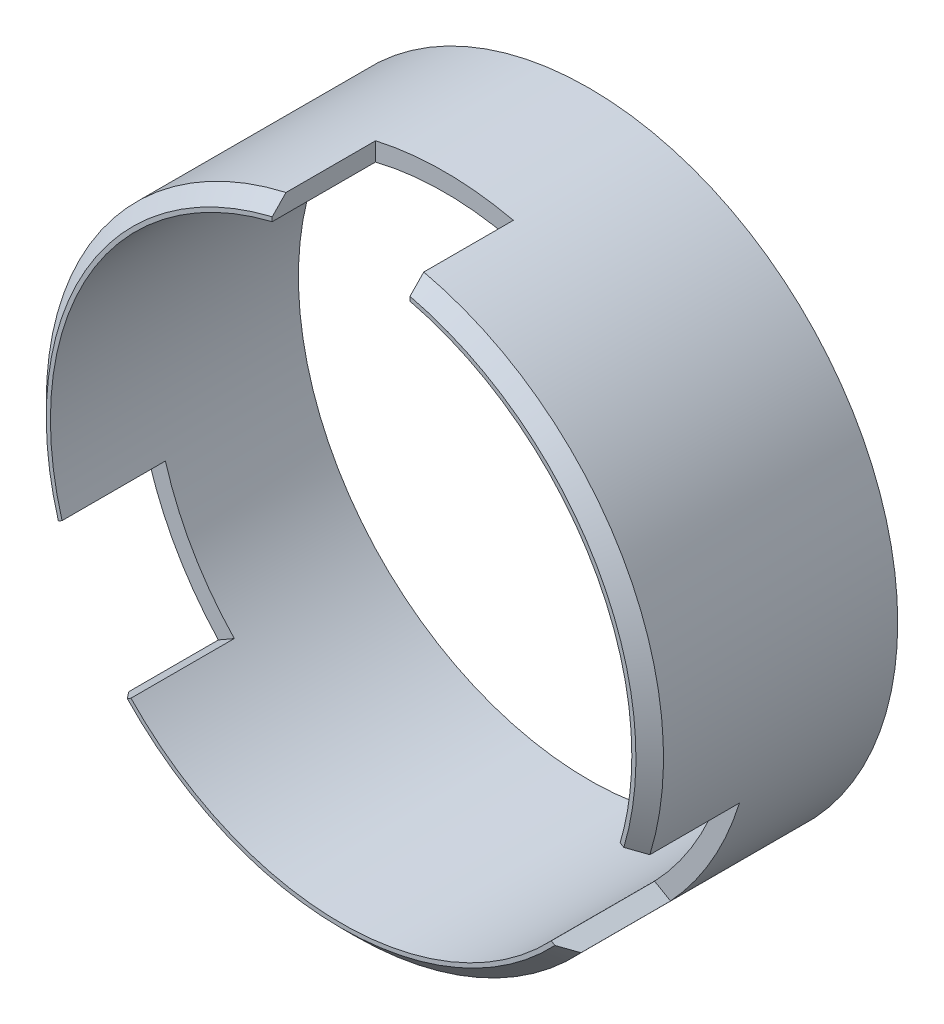
ISO-10303-21;
HEADER;
FILE_DESCRIPTION(('STEP AP214'),'2;1');
FILE_NAME('part.step','',(''),(''),'','','');
FILE_SCHEMA(('AUTOMOTIVE_DESIGN { 1 0 10303 214 1 1 1 1 }'));
ENDSEC;
DATA;
#1=APPLICATION_CONTEXT('core data for automotive mechanical design processes');
#2=APPLICATION_PROTOCOL_DEFINITION('international standard','automotive_design',2000,#1);
#3=PRODUCT_CONTEXT('',#1,'mechanical');
#4=PRODUCT('Part','Part','',(#3));
#5=PRODUCT_RELATED_PRODUCT_CATEGORY('part','',(#4));
#6=PRODUCT_DEFINITION_FORMATION('','',#4);
#7=PRODUCT_DEFINITION_CONTEXT('part definition',#1,'design');
#8=PRODUCT_DEFINITION('design','',#6,#7);
#9=PRODUCT_DEFINITION_SHAPE('','',#8);
#10=(LENGTH_UNIT() NAMED_UNIT(*) SI_UNIT(.MILLI.,.METRE.));
#11=(NAMED_UNIT(*) PLANE_ANGLE_UNIT() SI_UNIT($,.RADIAN.));
#12=(NAMED_UNIT(*) SI_UNIT($,.STERADIAN.) SOLID_ANGLE_UNIT());
#13=UNCERTAINTY_MEASURE_WITH_UNIT(LENGTH_MEASURE(1.E-05),#10,'distance_accuracy_value','');
#14=(GEOMETRIC_REPRESENTATION_CONTEXT(3) GLOBAL_UNCERTAINTY_ASSIGNED_CONTEXT((#13)) GLOBAL_UNIT_ASSIGNED_CONTEXT((#10,
#11,#12)) REPRESENTATION_CONTEXT('',''));
#15=CARTESIAN_POINT('',(0.,0.,0.));
#16=DIRECTION('',(0.,0.,1.));
#17=DIRECTION('',(1.,0.,0.));
#18=AXIS2_PLACEMENT_3D('',#15,#16,#17);
#19=CARTESIAN_POINT('',(0.,0.,18.));
#20=DIRECTION('',(0.,0.,1.));
#21=DIRECTION('',(1.,0.,0.));
#22=AXIS2_PLACEMENT_3D('',#19,#20,#21);
#23=PLANE('',#22);
#24=CARTESIAN_POINT('',(0.,0.,18.));
#25=DIRECTION('',(0.,0.,1.));
#26=DIRECTION('',(1.,0.,0.));
#27=AXIS2_PLACEMENT_3D('',#24,#25,#26);
#28=CIRCLE('',#27,21.1);
#29=CARTESIAN_POINT('',(20.2526758547838,-5.91938516490317,18.));
#30=VERTEX_POINT('',#29);
#31=CARTESIAN_POINT('',(5.0000000000032,20.499024367027,18.));
#32=VERTEX_POINT('',#31);
#33=EDGE_CURVE('E124',#30,#32,#28,.T.);
#34=ORIENTED_EDGE('',*,*,#33,.F.);
#35=DIRECTION('',(0.866025403877032,-0.499999999839625,0.));
#36=VECTOR('',#35,1.);
#37=CARTESIAN_POINT('',(20.252675855,-5.919385165,18.));
#38=LINE('',#37,#36);
#39=CARTESIAN_POINT('',(20.5199889011268,-6.07371842411497,18.0000000000514));
#40=VERTEX_POINT('',#39);
#41=EDGE_CURVE('E115',#30,#40,#38,.T.);
#42=ORIENTED_EDGE('',*,*,#41,.T.);
#43=CARTESIAN_POINT('',(0.,0.,18.0000000001028));
#44=DIRECTION('',(0.,0.,-1.));
#45=DIRECTION('',(-1.,0.,0.));
#46=AXIS2_PLACEMENT_3D('',#43,#44,#45);
#47=CIRCLE('',#46,21.3999999998972);
#48=CARTESIAN_POINT('',(5.,20.8076908857711,18.0000000000514));
#49=VERTEX_POINT('',#48);
#50=EDGE_CURVE('E250',#49,#40,#47,.T.);
#51=ORIENTED_EDGE('',*,*,#50,.F.);
#52=DIRECTION('',(0.,1.,0.));
#53=VECTOR('',#52,1.);
#54=CARTESIAN_POINT('',(5.,19.,18.));
#55=LINE('',#54,#53);
#56=EDGE_CURVE('E149',#32,#49,#55,.T.);
#57=ORIENTED_EDGE('',*,*,#56,.F.);
#58=EDGE_LOOP('',(#34,#42,#51,#57));
#59=FACE_BOUND('',#58,.T.);
#60=ADVANCED_FACE('F16',(#59),#23,.T.);
#61=CARTESIAN_POINT('',(0.,0.,18.));
#62=DIRECTION('',(0.,0.,1.));
#63=DIRECTION('',(1.,0.,0.));
#64=AXIS2_PLACEMENT_3D('',#61,#62,#63);
#65=PLANE('',#64);
#66=DIRECTION('',(-0.866025402474184,-0.500000002269428,0.));
#67=VECTOR('',#66,1.);
#68=CARTESIAN_POINT('',(-15.252675855,-14.579639202,18.));
#69=LINE('',#68,#67);
#70=CARTESIAN_POINT('',(-15.2526758547904,-14.579639202407,18.));
#71=VERTEX_POINT('',#70);
#72=CARTESIAN_POINT('',(-15.5199889010034,-14.7339724620438,18.0000000000109));
#73=VERTEX_POINT('',#72);
#74=EDGE_CURVE('E102',#71,#73,#69,.T.);
#75=ORIENTED_EDGE('',*,*,#74,.T.);
#76=CARTESIAN_POINT('',(0.,0.,18.0000000000218));
#77=DIRECTION('',(0.,0.,-1.));
#78=DIRECTION('',(-1.,0.,0.));
#79=AXIS2_PLACEMENT_3D('',#76,#77,#78);
#80=CIRCLE('',#79,21.3999999999782);
#81=CARTESIAN_POINT('',(15.5199889013319,-14.7339724616978,18.0000000000109));
#82=VERTEX_POINT('',#81);
#83=EDGE_CURVE('E134',#82,#73,#80,.T.);
#84=ORIENTED_EDGE('',*,*,#83,.F.);
#85=DIRECTION('',(0.866025403838329,-0.499999999906659,0.));
#86=VECTOR('',#85,1.);
#87=CARTESIAN_POINT('',(13.954482672,-13.830127019,18.));
#88=LINE('',#87,#86);
#89=CARTESIAN_POINT('',(15.252675854768,-14.5796392023447,18.));
#90=VERTEX_POINT('',#89);
#91=EDGE_CURVE('E120',#90,#82,#88,.T.);
#92=ORIENTED_EDGE('',*,*,#91,.F.);
#93=CARTESIAN_POINT('',(0.,0.,18.));
#94=DIRECTION('',(0.,0.,1.));
#95=DIRECTION('',(1.,0.,0.));
#96=AXIS2_PLACEMENT_3D('',#93,#94,#95);
#97=CIRCLE('',#96,21.1);
#98=EDGE_CURVE('E19',#71,#90,#97,.T.);
#99=ORIENTED_EDGE('',*,*,#98,.F.);
#100=EDGE_LOOP('',(#75,#84,#92,#99));
#101=FACE_BOUND('',#100,.T.);
#102=ADVANCED_FACE('F119',(#101),#65,.T.);
#103=CARTESIAN_POINT('',(-5.,24.,10.5));
#104=DIRECTION('',(-1.,0.,0.));
#105=DIRECTION('',(0.,0.,1.));
#106=AXIS2_PLACEMENT_3D('',#103,#104,#105);
#107=PLANE('',#106);
#108=DIRECTION('',(0.,1.,0.));
#109=VECTOR('',#108,1.);
#110=CARTESIAN_POINT('',(-5.,24.,18.));
#111=LINE('',#110,#109);
#112=CARTESIAN_POINT('',(-5.,20.8076908858692,17.999999999956));
#113=VERTEX_POINT('',#112);
#114=CARTESIAN_POINT('',(-5.0000000000032,20.499024367027,18.));
#115=VERTEX_POINT('',#114);
#116=EDGE_CURVE('E114',#113,#115,#111,.F.);
#117=ORIENTED_EDGE('',*,*,#116,.T.);
#118=DIRECTION('',(0.,0.,1.));
#119=VECTOR('',#118,1.);
#120=CARTESIAN_POINT('',(-5.0000000000064,20.4990243670263,9.));
#121=LINE('',#120,#119);
#122=CARTESIAN_POINT('',(-5.0000000000032,20.499024367027,10.5));
#123=VERTEX_POINT('',#122);
#124=EDGE_CURVE('E323',#123,#115,#121,.T.);
#125=ORIENTED_EDGE('',*,*,#124,.F.);
#126=DIRECTION('',(0.,1.,0.));
#127=VECTOR('',#126,1.);
#128=CARTESIAN_POINT('',(-5.,19.,10.5));
#129=LINE('',#128,#127);
#130=CARTESIAN_POINT('',(-4.99999999999862,21.8348345539877,10.4999999999999));
#131=VERTEX_POINT('',#130);
#132=EDGE_CURVE('E151',#131,#123,#129,.F.);
#133=ORIENTED_EDGE('',*,*,#132,.F.);
#134=DIRECTION('',(0.,0.,-1.));
#135=VECTOR('',#134,1.);
#136=CARTESIAN_POINT('',(-4.99999999999725,21.834834553988,8.5));
#137=LINE('',#136,#135);
#138=CARTESIAN_POINT('',(-4.99999999999862,21.8348345539878,16.9999999999998));
#139=VERTEX_POINT('',#138);
#140=EDGE_CURVE('E184',#139,#131,#137,.T.);
#141=ORIENTED_EDGE('',*,*,#140,.F.);
#142=CARTESIAN_POINT('',(-5.00000000002054,20.8076908859266,17.9999999999244));
#143=CARTESIAN_POINT('',(-5.00000000001027,20.9789861483327,17.8334408241759));
#144=CARTESIAN_POINT('',(-5.00000000000342,21.1502290854001,17.6668279027869));
#145=CARTESIAN_POINT('',(-4.99999999999658,21.4926103080866,17.3334945694782));
#146=CARTESIAN_POINT('',(-4.99999999999658,21.6637485937063,17.1667741575589));
#147=CARTESIAN_POINT('',(-5.,21.8348345539877,16.9999999999997));
#148=B_SPLINE_CURVE_WITH_KNOTS('',3,(#142,#143,#144,#145,#146,#147),.UNSPECIFIED.,.F.,.F.,(4,2,
4),(0.,0.716767801748237,1.43353560027046),.UNSPECIFIED.);
#149=EDGE_CURVE('E261',#113,#139,#148,.T.);
#150=ORIENTED_EDGE('',*,*,#149,.F.);
#151=EDGE_LOOP('',(#117,#125,#133,#141,#150));
#152=FACE_BOUND('',#151,.T.);
#153=ADVANCED_FACE('F275',(#152),#107,.F.);
#154=CARTESIAN_POINT('',(-5.,19.,10.5));
#155=DIRECTION('',(0.,0.,-1.));
#156=DIRECTION('',(-1.,0.,0.));
#157=AXIS2_PLACEMENT_3D('',#154,#155,#156);
#158=PLANE('',#157);
#159=DIRECTION('',(0.,1.,0.));
#160=VECTOR('',#159,1.);
#161=CARTESIAN_POINT('',(5.,19.,10.5));
#162=LINE('',#161,#160);
#163=CARTESIAN_POINT('',(4.99999999999862,21.8348345539877,10.4999999999999));
#164=VERTEX_POINT('',#163);
#165=CARTESIAN_POINT('',(5.0000000000032,20.499024367027,10.5));
#166=VERTEX_POINT('',#165);
#167=EDGE_CURVE('E125',#164,#166,#162,.F.);
#168=ORIENTED_EDGE('',*,*,#167,.F.);
#169=CARTESIAN_POINT('',(0.,0.,10.4999999999999));
#170=DIRECTION('',(0.,0.,-1.));
#171=DIRECTION('',(-1.,0.,0.));
#172=AXIS2_PLACEMENT_3D('',#169,#170,#171);
#173=CIRCLE('',#172,22.4);
#174=EDGE_CURVE('E181',#131,#164,#173,.T.);
#175=ORIENTED_EDGE('',*,*,#174,.F.);
#176=ORIENTED_EDGE('',*,*,#132,.T.);
#177=CARTESIAN_POINT('',(0.,0.,10.5));
#178=DIRECTION('',(0.,0.,1.));
#179=DIRECTION('',(1.,0.,0.));
#180=AXIS2_PLACEMENT_3D('',#177,#178,#179);
#181=CIRCLE('',#180,21.1);
#182=EDGE_CURVE('E157',#166,#123,#181,.T.);
#183=ORIENTED_EDGE('',*,*,#182,.F.);
#184=EDGE_LOOP('',(#168,#175,#176,#183));
#185=FACE_BOUND('',#184,.T.);
#186=ADVANCED_FACE('F272',(#185),#158,.F.);
#187=CARTESIAN_POINT('',(5.,19.,10.5));
#188=DIRECTION('',(1.,0.,0.));
#189=DIRECTION('',(0.,0.,-1.));
#190=AXIS2_PLACEMENT_3D('',#187,#188,#189);
#191=PLANE('',#190);
#192=ORIENTED_EDGE('',*,*,#167,.T.);
#193=DIRECTION('',(0.,0.,-1.));
#194=VECTOR('',#193,1.);
#195=CARTESIAN_POINT('',(5.0000000000064,20.4990243670263,9.));
#196=LINE('',#195,#194);
#197=EDGE_CURVE('E154',#32,#166,#196,.T.);
#198=ORIENTED_EDGE('',*,*,#197,.F.);
#199=ORIENTED_EDGE('',*,*,#56,.T.);
#200=CARTESIAN_POINT('',(5.,21.8348345539877,16.9999999999997));
#201=CARTESIAN_POINT('',(5.,21.6637485936958,17.1667741575732));
#202=CARTESIAN_POINT('',(5.,21.4926103080636,17.3334945695047));
#203=CARTESIAN_POINT('',(5.,21.1502290853478,17.6668279028337));
#204=CARTESIAN_POINT('',(5.,20.9789861482639,17.8334408242307));
#205=CARTESIAN_POINT('',(5.,20.8076908858391,17.9999999999852));
#206=B_SPLINE_CURVE_WITH_KNOTS('',3,(#200,#201,#202,#203,#204,#205),.UNSPECIFIED.,.F.,.F.,(4,2,
4),(0.,0.716767798574769,1.43353560037556),.UNSPECIFIED.);
#207=CARTESIAN_POINT('',(4.99999999999862,21.8348345539878,16.9999999999998));
#208=VERTEX_POINT('',#207);
#209=EDGE_CURVE('E253',#208,#49,#206,.T.);
#210=ORIENTED_EDGE('',*,*,#209,.F.);
#211=DIRECTION('',(0.,0.,1.));
#212=VECTOR('',#211,1.);
#213=CARTESIAN_POINT('',(4.99999999999725,21.834834553988,8.5));
#214=LINE('',#213,#212);
#215=EDGE_CURVE('E180',#164,#208,#214,.T.);
#216=ORIENTED_EDGE('',*,*,#215,.F.);
#217=EDGE_LOOP('',(#192,#198,#199,#210,#216));
#218=FACE_BOUND('',#217,.T.);
#219=ADVANCED_FACE('F268',(#218),#191,.F.);
#220=CARTESIAN_POINT('',(0.,0.,0.));
#221=DIRECTION('',(0.,0.,1.));
#222=DIRECTION('',(1.,0.,0.));
#223=AXIS2_PLACEMENT_3D('',#220,#221,#222);
#224=CYLINDRICAL_SURFACE('',#223,21.1);
#225=CARTESIAN_POINT('',(0.,0.,0.));
#226=DIRECTION('',(0.,0.,1.));
#227=DIRECTION('',(1.,0.,0.));
#228=AXIS2_PLACEMENT_3D('',#225,#226,#227);
#229=CIRCLE('',#228,21.1);
#230=CARTESIAN_POINT('',(21.1,0.,0.));
#231=VERTEX_POINT('',#230);
#232=EDGE_CURVE('E177',#231,#231,#229,.T.);
#233=ORIENTED_EDGE('',*,*,#232,.F.);
#234=EDGE_LOOP('',(#233));
#235=FACE_BOUND('',#234,.T.);
#236=ORIENTED_EDGE('',*,*,#124,.T.);
#237=CARTESIAN_POINT('',(0.,0.,18.));
#238=DIRECTION('',(0.,0.,1.));
#239=DIRECTION('',(1.,0.,0.));
#240=AXIS2_PLACEMENT_3D('',#237,#238,#239);
#241=CIRCLE('',#240,21.1);
#242=CARTESIAN_POINT('',(-20.2526758549088,-5.91938516468666,18.));
#243=VERTEX_POINT('',#242);
#244=EDGE_CURVE('E172',#243,#115,#241,.F.);
#245=ORIENTED_EDGE('',*,*,#244,.F.);
#246=DIRECTION('',(0.,0.,1.));
#247=VECTOR('',#246,1.);
#248=CARTESIAN_POINT('',(-20.2526758552258,-5.91938516460897,10.5));
#249=LINE('',#248,#247);
#250=CARTESIAN_POINT('',(-20.252675854974,-5.91938516446362,10.5));
#251=VERTEX_POINT('',#250);
#252=EDGE_CURVE('E307',#251,#243,#249,.T.);
#253=ORIENTED_EDGE('',*,*,#252,.F.);
#254=CARTESIAN_POINT('',(0.,0.,10.5));
#255=DIRECTION('',(0.,0.,1.));
#256=DIRECTION('',(1.,0.,0.));
#257=AXIS2_PLACEMENT_3D('',#254,#255,#256);
#258=CIRCLE('',#257,21.1);
#259=CARTESIAN_POINT('',(-15.2526758547904,-14.579639202407,10.5));
#260=VERTEX_POINT('',#259);
#261=EDGE_CURVE('E129',#260,#251,#258,.F.);
#262=ORIENTED_EDGE('',*,*,#261,.F.);
#263=DIRECTION('',(0.,0.,1.));
#264=VECTOR('',#263,1.);
#265=CARTESIAN_POINT('',(-15.2526758545427,-14.579639202792,10.5));
#266=LINE('',#265,#264);
#267=EDGE_CURVE('E107',#71,#260,#266,.F.);
#268=ORIENTED_EDGE('',*,*,#267,.F.);
#269=ORIENTED_EDGE('',*,*,#98,.T.);
#270=DIRECTION('',(0.,0.,1.));
#271=VECTOR('',#270,1.);
#272=CARTESIAN_POINT('',(15.2526758547928,-14.579639202359,10.5));
#273=LINE('',#272,#271);
#274=CARTESIAN_POINT('',(15.252675854768,-14.5796392023447,10.5));
#275=VERTEX_POINT('',#274);
#276=EDGE_CURVE('E141',#275,#90,#273,.T.);
#277=ORIENTED_EDGE('',*,*,#276,.F.);
#278=CARTESIAN_POINT('',(0.,0.,10.5));
#279=DIRECTION('',(0.,0.,1.));
#280=DIRECTION('',(1.,0.,0.));
#281=AXIS2_PLACEMENT_3D('',#278,#279,#280);
#282=CIRCLE('',#281,21.1);
#283=CARTESIAN_POINT('',(20.2526758547838,-5.91938516490317,10.5));
#284=VERTEX_POINT('',#283);
#285=EDGE_CURVE('E225',#284,#275,#282,.F.);
#286=ORIENTED_EDGE('',*,*,#285,.F.);
#287=DIRECTION('',(0.,0.,1.));
#288=VECTOR('',#287,1.);
#289=CARTESIAN_POINT('',(20.2526758549758,-5.91938516504198,10.5));
#290=LINE('',#289,#288);
#291=EDGE_CURVE('E144',#30,#284,#290,.F.);
#292=ORIENTED_EDGE('',*,*,#291,.F.);
#293=ORIENTED_EDGE('',*,*,#33,.T.);
#294=ORIENTED_EDGE('',*,*,#197,.T.);
#295=ORIENTED_EDGE('',*,*,#182,.T.);
#296=EDGE_LOOP('',(#236,#245,#253,#262,#268,#269,#277,#286,#292,#293,#294,#295));
#297=FACE_BOUND('',#296,.T.);
#298=ADVANCED_FACE('F127',(#235,#297),#224,.F.);
#299=CARTESIAN_POINT('',(0.,0.,17.));
#300=DIRECTION('',(0.,0.,-1.));
#301=DIRECTION('',(-1.,0.,0.));
#302=AXIS2_PLACEMENT_3D('',#299,#300,#301);
#303=CONICAL_SURFACE('',#302,22.4,0.785398163397448);
#304=ORIENTED_EDGE('',*,*,#209,.T.);
#305=ORIENTED_EDGE('',*,*,#50,.T.);
#306=CARTESIAN_POINT('',(21.409521411158,-6.58729025813923,17.0000000000155));
#307=CARTESIAN_POINT('',(21.2613566232876,-6.5017472780037,17.1667741576061));
#308=CARTESIAN_POINT('',(21.1131465203446,-6.41617813519727,17.3334945695555));
#309=CARTESIAN_POINT('',(20.8166356836459,-6.24498752385733,17.666827902922));
#310=CARTESIAN_POINT('',(20.6683349498899,-6.15936605532359,17.8334408243386));
#311=CARTESIAN_POINT('',(20.5199889010609,-6.07371842411871,18.0000000001135));
#312=B_SPLINE_CURVE_WITH_KNOTS('',3,(#306,#307,#308,#309,#310,#311),.UNSPECIFIED.,.F.,.F.,(4,2,
4),(0.,0.716767798649083,1.43353560052418),.UNSPECIFIED.);
#313=CARTESIAN_POINT('',(21.4095214111687,-6.58729025810071,17.0000000000053));
#314=VERTEX_POINT('',#313);
#315=EDGE_CURVE('E147',#314,#40,#312,.T.);
#316=ORIENTED_EDGE('',*,*,#315,.F.);
#317=CARTESIAN_POINT('',(0.,0.,17.));
#318=DIRECTION('',(0.,0.,-1.));
#319=DIRECTION('',(-1.,0.,0.));
#320=AXIS2_PLACEMENT_3D('',#317,#318,#319);
#321=CIRCLE('',#320,22.4);
#322=EDGE_CURVE('E175',#208,#314,#321,.T.);
#323=ORIENTED_EDGE('',*,*,#322,.F.);
#324=EDGE_LOOP('',(#304,#305,#316,#323));
#325=FACE_BOUND('',#324,.T.);
#326=ADVANCED_FACE('F240',(#325),#303,.T.);
#327=CARTESIAN_POINT('',(23.284609691,-7.669872981,10.5));
#328=DIRECTION('',(0.499999999906659,0.866025403838329,0.));
#329=DIRECTION('',(-0.866025403838329,0.499999999906659,0.));
#330=AXIS2_PLACEMENT_3D('',#327,#328,#329);
#331=PLANE('',#330);
#332=DIRECTION('',(-0.866025403838711,0.499999999905998,0.));
#333=VECTOR('',#332,1.);
#334=CARTESIAN_POINT('',(21.409521411,-6.587290258,10.5));
#335=LINE('',#334,#333);
#336=CARTESIAN_POINT('',(21.4095214111809,-6.58729025807917,10.4999999999999));
#337=VERTEX_POINT('',#336);
#338=EDGE_CURVE('E146',#337,#284,#335,.T.);
#339=ORIENTED_EDGE('',*,*,#338,.F.);
#340=DIRECTION('',(0.,0.,-1.));
#341=VECTOR('',#340,1.);
#342=CARTESIAN_POINT('',(21.4095214111876,-6.5872902580577,8.5));
#343=LINE('',#342,#341);
#344=EDGE_CURVE('E171',#314,#337,#343,.T.);
#345=ORIENTED_EDGE('',*,*,#344,.F.);
#346=ORIENTED_EDGE('',*,*,#315,.T.);
#347=ORIENTED_EDGE('',*,*,#41,.F.);
#348=ORIENTED_EDGE('',*,*,#291,.T.);
#349=EDGE_LOOP('',(#339,#345,#346,#347,#348));
#350=FACE_BOUND('',#349,.T.);
#351=ADVANCED_FACE('F235',(#350),#331,.F.);
#352=CARTESIAN_POINT('',(18.954482672,-5.169872981,10.5));
#353=DIRECTION('',(0.,0.,-1.));
#354=DIRECTION('',(-1.,0.,0.));
#355=AXIS2_PLACEMENT_3D('',#352,#353,#354);
#356=PLANE('',#355);
#357=DIRECTION('',(0.866025403838329,-0.499999999906659,0.));
#358=VECTOR('',#357,1.);
#359=CARTESIAN_POINT('',(13.954482672,-13.830127019,10.5));
#360=LINE('',#359,#358);
#361=CARTESIAN_POINT('',(16.4095214112197,-15.2475442958767,10.4999999999999));
#362=VERTEX_POINT('',#361);
#363=EDGE_CURVE('E143',#362,#275,#360,.F.);
#364=ORIENTED_EDGE('',*,*,#363,.F.);
#365=CARTESIAN_POINT('',(0.,0.,10.4999999999999));
#366=DIRECTION('',(0.,0.,-1.));
#367=DIRECTION('',(-1.,0.,0.));
#368=AXIS2_PLACEMENT_3D('',#365,#366,#367);
#369=CIRCLE('',#368,22.4);
#370=EDGE_CURVE('E167',#337,#362,#369,.T.);
#371=ORIENTED_EDGE('',*,*,#370,.F.);
#372=ORIENTED_EDGE('',*,*,#338,.T.);
#373=ORIENTED_EDGE('',*,*,#285,.T.);
#374=EDGE_LOOP('',(#364,#371,#372,#373));
#375=FACE_BOUND('',#374,.T.);
#376=ADVANCED_FACE('F231',(#375),#356,.F.);
#377=CARTESIAN_POINT('',(13.954482672,-13.830127019,10.5));
#378=DIRECTION('',(-0.499999999906659,-0.866025403838329,0.));
#379=DIRECTION('',(0.866025403838329,-0.499999999906659,0.));
#380=AXIS2_PLACEMENT_3D('',#377,#378,#379);
#381=PLANE('',#380);
#382=ORIENTED_EDGE('',*,*,#276,.T.);
#383=ORIENTED_EDGE('',*,*,#91,.T.);
#384=CARTESIAN_POINT('',(16.4095214113214,-15.2475442958562,17.0000000001732));
#385=CARTESIAN_POINT('',(16.2613566234616,-15.1620013156268,17.166774157699));
#386=CARTESIAN_POINT('',(16.1131465205281,-15.0764321727592,17.3334945695996));
#387=CARTESIAN_POINT('',(15.8166356838467,-14.9052415613626,17.6668279029003));
#388=CARTESIAN_POINT('',(15.6683349500983,-14.8196200928332,17.8334408242999));
#389=CARTESIAN_POINT('',(15.5199889012758,-14.7339724616655,18.0000000000738));
#390=B_SPLINE_CURVE_WITH_KNOTS('',3,(#384,#385,#386,#387,#388,#389),.UNSPECIFIED.,.F.,.F.,(4,2,
4),(0.,0.71676779859465,1.43353560041537),.UNSPECIFIED.);
#391=CARTESIAN_POINT('',(16.4095214111876,-15.2475442958581,17.0000000000361));
#392=VERTEX_POINT('',#391);
#393=EDGE_CURVE('E140',#392,#82,#390,.T.);
#394=ORIENTED_EDGE('',*,*,#393,.F.);
#395=DIRECTION('',(0.,0.,1.));
#396=VECTOR('',#395,1.);
#397=CARTESIAN_POINT('',(16.4095214110564,-15.2475442960524,8.5));
#398=LINE('',#397,#396);
#399=EDGE_CURVE('E170',#362,#392,#398,.T.);
#400=ORIENTED_EDGE('',*,*,#399,.F.);
#401=ORIENTED_EDGE('',*,*,#363,.T.);
#402=EDGE_LOOP('',(#382,#383,#394,#400,#401));
#403=FACE_BOUND('',#402,.T.);
#404=ADVANCED_FACE('F227',(#403),#381,.F.);
#405=CARTESIAN_POINT('',(0.,0.,17.));
#406=DIRECTION('',(0.,0.,-1.));
#407=DIRECTION('',(-1.,0.,0.));
#408=AXIS2_PLACEMENT_3D('',#405,#406,#407);
#409=CONICAL_SURFACE('',#408,22.4,0.785398163397448);
#410=CARTESIAN_POINT('',(-16.4095214110372,-15.2475442960786,16.9999999999963));
#411=CARTESIAN_POINT('',(-16.2613566231754,-15.1620013159435,17.1667741575754));
#412=CARTESIAN_POINT('',(-16.1131465202395,-15.0764321731382,17.3334945695124));
#413=CARTESIAN_POINT('',(-15.8166356835524,-14.9052415618018,17.6668279028523));
#414=CARTESIAN_POINT('',(-15.6683349498008,-14.8196200932706,17.8334408242547));
#415=CARTESIAN_POINT('',(-15.5199889009746,-14.7339724620689,18.0000000000145));
#416=B_SPLINE_CURVE_WITH_KNOTS('',3,(#410,#411,#412,#413,#414,#415),.UNSPECIFIED.,.F.,.F.,(4,2,
4),(0.,0.716767798608581,1.43353560044318),.UNSPECIFIED.);
#417=CARTESIAN_POINT('',(-16.4095214110468,-15.2475442960655,16.9999999999981));
#418=VERTEX_POINT('',#417);
#419=EDGE_CURVE('E110',#418,#73,#416,.T.);
#420=ORIENTED_EDGE('',*,*,#419,.F.);
#421=CARTESIAN_POINT('',(0.,0.,17.));
#422=DIRECTION('',(0.,0.,-1.));
#423=DIRECTION('',(-1.,0.,0.));
#424=AXIS2_PLACEMENT_3D('',#421,#422,#423);
#425=CIRCLE('',#424,22.4);
#426=EDGE_CURVE('E308',#392,#418,#425,.T.);
#427=ORIENTED_EDGE('',*,*,#426,.F.);
#428=ORIENTED_EDGE('',*,*,#393,.T.);
#429=ORIENTED_EDGE('',*,*,#83,.T.);
#430=EDGE_LOOP('',(#420,#427,#428,#429));
#431=FACE_BOUND('',#430,.T.);
#432=ADVANCED_FACE('F210',(#431),#409,.T.);
#433=CARTESIAN_POINT('',(-18.284609691,-16.330127019,10.5));
#434=DIRECTION('',(0.499999999906659,-0.866025403838329,0.));
#435=DIRECTION('',(0.866025403838329,0.499999999906659,0.));
#436=AXIS2_PLACEMENT_3D('',#433,#434,#435);
#437=PLANE('',#436);
#438=ORIENTED_EDGE('',*,*,#74,.F.);
#439=ORIENTED_EDGE('',*,*,#267,.T.);
#440=DIRECTION('',(0.866025403514553,0.500000000467455,0.));
#441=VECTOR('',#440,1.);
#442=CARTESIAN_POINT('',(-16.409521411,-15.247544296,10.5));
#443=LINE('',#442,#441);
#444=CARTESIAN_POINT('',(-16.4095214110624,-15.247544296046,10.4999999999999));
#445=VERTEX_POINT('',#444);
#446=EDGE_CURVE('E131',#445,#260,#443,.T.);
#447=ORIENTED_EDGE('',*,*,#446,.F.);
#448=DIRECTION('',(0.,0.,-1.));
#449=VECTOR('',#448,1.);
#450=CARTESIAN_POINT('',(-16.4095214110564,-15.2475442960524,8.5));
#451=LINE('',#450,#449);
#452=EDGE_CURVE('E166',#418,#445,#451,.T.);
#453=ORIENTED_EDGE('',*,*,#452,.F.);
#454=ORIENTED_EDGE('',*,*,#419,.T.);
#455=EDGE_LOOP('',(#438,#439,#447,#453,#454));
#456=FACE_BOUND('',#455,.T.);
#457=ADVANCED_FACE('F104',(#456),#437,.F.);
#458=CARTESIAN_POINT('',(-13.954482672,-13.830127019,10.5));
#459=DIRECTION('',(0.,0.,-1.));
#460=DIRECTION('',(-1.,0.,0.));
#461=AXIS2_PLACEMENT_3D('',#458,#459,#460);
#462=PLANE('',#461);
#463=DIRECTION('',(-0.866025403838329,-0.499999999906659,0.));
#464=VECTOR('',#463,1.);
#465=CARTESIAN_POINT('',(-18.954482672,-5.169872981,10.5));
#466=LINE('',#465,#464);
#467=CARTESIAN_POINT('',(-21.4095214112489,-6.58729025785832,10.4999999999999));
#468=VERTEX_POINT('',#467);
#469=EDGE_CURVE('E192',#468,#251,#466,.F.);
#470=ORIENTED_EDGE('',*,*,#469,.F.);
#471=CARTESIAN_POINT('',(0.,0.,10.4999999999999));
#472=DIRECTION('',(0.,0.,-1.));
#473=DIRECTION('',(-1.,0.,0.));
#474=AXIS2_PLACEMENT_3D('',#471,#472,#473);
#475=CIRCLE('',#474,22.4);
#476=EDGE_CURVE('E163',#445,#468,#475,.T.);
#477=ORIENTED_EDGE('',*,*,#476,.F.);
#478=ORIENTED_EDGE('',*,*,#446,.T.);
#479=ORIENTED_EDGE('',*,*,#261,.T.);
#480=EDGE_LOOP('',(#470,#477,#478,#479));
#481=FACE_BOUND('',#480,.T.);
#482=ADVANCED_FACE('F202',(#481),#462,.F.);
#483=CARTESIAN_POINT('',(-18.954482672,-5.169872981,10.5));
#484=DIRECTION('',(-0.499999999906659,0.866025403838329,0.));
#485=DIRECTION('',(-0.866025403838329,-0.499999999906659,0.));
#486=AXIS2_PLACEMENT_3D('',#483,#484,#485);
#487=PLANE('',#486);
#488=ORIENTED_EDGE('',*,*,#469,.T.);
#489=ORIENTED_EDGE('',*,*,#252,.T.);
#490=DIRECTION('',(0.866025403877032,0.499999999839625,0.));
#491=VECTOR('',#490,1.);
#492=CARTESIAN_POINT('',(-20.519988901,-6.073718424,18.));
#493=LINE('',#492,#491);
#494=CARTESIAN_POINT('',(-20.5199889012391,-6.07371842389117,18.0000000000072));
#495=VERTEX_POINT('',#494);
#496=EDGE_CURVE('E176',#495,#243,#493,.T.);
#497=ORIENTED_EDGE('',*,*,#496,.F.);
#498=CARTESIAN_POINT('',(-20.5199889012952,-6.07371842367662,18.0000000000144));
#499=CARTESIAN_POINT('',(-20.6683349501167,-6.15936605487562,17.8334408242511));
#500=CARTESIAN_POINT('',(-20.8166356838638,-6.24498752340421,17.6668279028454));
#501=CARTESIAN_POINT('',(-21.1131465205419,-6.41617813473535,17.3334945694991));
#502=CARTESIAN_POINT('',(-21.2613566234733,-6.50174727753814,17.166774157559));
#503=CARTESIAN_POINT('',(-21.4095214113307,-6.58729025767076,16.9999999999769));
#504=B_SPLINE_CURVE_WITH_KNOTS('',3,(#498,#499,#500,#501,#502,#503),.UNSPECIFIED.,.F.,.F.,(4,2,
4),(0.,0.716767801830148,1.43353560043428),.UNSPECIFIED.);
#505=CARTESIAN_POINT('',(-21.4095214112591,-6.58729025786424,16.9999999999884));
#506=VERTEX_POINT('',#505);
#507=EDGE_CURVE('E34',#495,#506,#504,.T.);
#508=ORIENTED_EDGE('',*,*,#507,.T.);
#509=DIRECTION('',(0.,0.,1.));
#510=VECTOR('',#509,1.);
#511=CARTESIAN_POINT('',(-21.4095214111875,-6.58729025805771,8.5));
#512=LINE('',#511,#510);
#513=EDGE_CURVE('E162',#468,#506,#512,.T.);
#514=ORIENTED_EDGE('',*,*,#513,.F.);
#515=EDGE_LOOP('',(#488,#489,#497,#508,#514));
#516=FACE_BOUND('',#515,.T.);
#517=ADVANCED_FACE('F196',(#516),#487,.F.);
#518=CARTESIAN_POINT('',(0.,0.,0.));
#519=DIRECTION('',(0.,0.,1.));
#520=DIRECTION('',(1.,0.,0.));
#521=AXIS2_PLACEMENT_3D('',#518,#519,#520);
#522=PLANE('',#521);
#523=ORIENTED_EDGE('',*,*,#232,.T.);
#524=EDGE_LOOP('',(#523));
#525=FACE_BOUND('',#524,.T.);
#526=CARTESIAN_POINT('',(0.,0.,0.));
#527=DIRECTION('',(0.,0.,-1.));
#528=DIRECTION('',(-1.,0.,0.));
#529=AXIS2_PLACEMENT_3D('',#526,#527,#528);
#530=CIRCLE('',#529,22.4);
#531=CARTESIAN_POINT('',(-22.4,0.,0.));
#532=VERTEX_POINT('',#531);
#533=EDGE_CURVE('E159',#532,#532,#530,.F.);
#534=ORIENTED_EDGE('',*,*,#533,.F.);
#535=EDGE_LOOP('',(#534));
#536=FACE_BOUND('',#535,.T.);
#537=ADVANCED_FACE('F201',(#525,#536),#522,.F.);
#538=CARTESIAN_POINT('',(0.,0.,18.));
#539=DIRECTION('',(0.,0.,1.));
#540=DIRECTION('',(1.,0.,0.));
#541=AXIS2_PLACEMENT_3D('',#538,#539,#540);
#542=PLANE('',#541);
#543=ORIENTED_EDGE('',*,*,#116,.F.);
#544=CARTESIAN_POINT('',(0.,0.,18.));
#545=DIRECTION('',(0.,0.,-1.));
#546=DIRECTION('',(-1.,0.,0.));
#547=AXIS2_PLACEMENT_3D('',#544,#545,#546);
#548=CIRCLE('',#547,21.4);
#549=EDGE_CURVE('E25',#495,#113,#548,.T.);
#550=ORIENTED_EDGE('',*,*,#549,.F.);
#551=ORIENTED_EDGE('',*,*,#496,.T.);
#552=ORIENTED_EDGE('',*,*,#244,.T.);
#553=EDGE_LOOP('',(#543,#550,#551,#552));
#554=FACE_BOUND('',#553,.T.);
#555=ADVANCED_FACE('F292',(#554),#542,.T.);
#556=CARTESIAN_POINT('',(0.,0.,0.));
#557=DIRECTION('',(0.,0.,-1.));
#558=DIRECTION('',(-1.,0.,0.));
#559=AXIS2_PLACEMENT_3D('',#556,#557,#558);
#560=CYLINDRICAL_SURFACE('',#559,22.4);
#561=ORIENTED_EDGE('',*,*,#215,.T.);
#562=ORIENTED_EDGE('',*,*,#322,.T.);
#563=ORIENTED_EDGE('',*,*,#344,.T.);
#564=ORIENTED_EDGE('',*,*,#370,.T.);
#565=ORIENTED_EDGE('',*,*,#399,.T.);
#566=ORIENTED_EDGE('',*,*,#426,.T.);
#567=ORIENTED_EDGE('',*,*,#452,.T.);
#568=ORIENTED_EDGE('',*,*,#476,.T.);
#569=ORIENTED_EDGE('',*,*,#513,.T.);
#570=CARTESIAN_POINT('',(0.,0.,16.9999999999999));
#571=DIRECTION('',(0.,0.,-1.));
#572=DIRECTION('',(-1.,0.,0.));
#573=AXIS2_PLACEMENT_3D('',#570,#571,#572);
#574=CIRCLE('',#573,22.4);
#575=EDGE_CURVE('E11',#139,#506,#574,.F.);
#576=ORIENTED_EDGE('',*,*,#575,.F.);
#577=ORIENTED_EDGE('',*,*,#140,.T.);
#578=ORIENTED_EDGE('',*,*,#174,.T.);
#579=EDGE_LOOP('',(#561,#562,#563,#564,#565,#566,#567,#568,#569,#576,#577,#578));
#580=FACE_BOUND('',#579,.T.);
#581=ORIENTED_EDGE('',*,*,#533,.T.);
#582=EDGE_LOOP('',(#581));
#583=FACE_BOUND('',#582,.T.);
#584=ADVANCED_FACE('F287',(#580,#583),#560,.T.);
#585=CARTESIAN_POINT('',(0.,0.,17.));
#586=DIRECTION('',(0.,0.,-1.));
#587=DIRECTION('',(-1.,0.,0.));
#588=AXIS2_PLACEMENT_3D('',#585,#586,#587);
#589=CONICAL_SURFACE('',#588,22.4,0.785398163397448);
#590=ORIENTED_EDGE('',*,*,#575,.T.);
#591=ORIENTED_EDGE('',*,*,#507,.F.);
#592=ORIENTED_EDGE('',*,*,#549,.T.);
#593=ORIENTED_EDGE('',*,*,#149,.T.);
#594=EDGE_LOOP('',(#590,#591,#592,#593));
#595=FACE_BOUND('',#594,.T.);
#596=ADVANCED_FACE('F193',(#595),#589,.T.);
#597=CLOSED_SHELL('',(#60,#102,#153,#186,#219,#298,#326,#351,#376,#404,#432,#457,#482,#517,#537,
#555,#584,#596));
#598=MANIFOLD_SOLID_BREP('B1',#597);
#599=ADVANCED_BREP_SHAPE_REPRESENTATION('',(#18,#598),#14);
#600=SHAPE_DEFINITION_REPRESENTATION(#9,#599);
ENDSEC;
END-ISO-10303-21;
